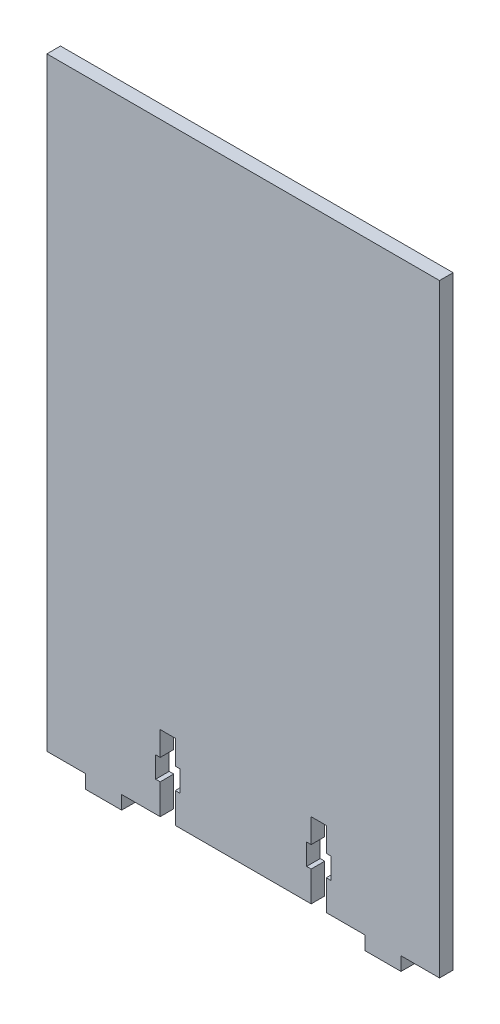
ISO-10303-21;
HEADER;
FILE_DESCRIPTION(('STEP AP214'),'2;1');
FILE_NAME('part.step','',(''),(''),'','','');
FILE_SCHEMA(('AUTOMOTIVE_DESIGN { 1 0 10303 214 1 1 1 1 }'));
ENDSEC;
DATA;
#1=APPLICATION_CONTEXT('core data for automotive mechanical design processes');
#2=APPLICATION_PROTOCOL_DEFINITION('international standard','automotive_design',2000,#1);
#3=PRODUCT_CONTEXT('',#1,'mechanical');
#4=PRODUCT('Part','Part','',(#3));
#5=PRODUCT_RELATED_PRODUCT_CATEGORY('part','',(#4));
#6=PRODUCT_DEFINITION_FORMATION('','',#4);
#7=PRODUCT_DEFINITION_CONTEXT('part definition',#1,'design');
#8=PRODUCT_DEFINITION('design','',#6,#7);
#9=PRODUCT_DEFINITION_SHAPE('','',#8);
#10=(LENGTH_UNIT() NAMED_UNIT(*) SI_UNIT(.MILLI.,.METRE.));
#11=(NAMED_UNIT(*) PLANE_ANGLE_UNIT() SI_UNIT($,.RADIAN.));
#12=(NAMED_UNIT(*) SI_UNIT($,.STERADIAN.) SOLID_ANGLE_UNIT());
#13=UNCERTAINTY_MEASURE_WITH_UNIT(LENGTH_MEASURE(1.E-05),#10,'distance_accuracy_value','');
#14=(GEOMETRIC_REPRESENTATION_CONTEXT(3) GLOBAL_UNCERTAINTY_ASSIGNED_CONTEXT((#13)) GLOBAL_UNIT_ASSIGNED_CONTEXT((#10,
#11,#12)) REPRESENTATION_CONTEXT('',''));
#15=CARTESIAN_POINT('',(0.,0.,0.));
#16=DIRECTION('',(0.,0.,1.));
#17=DIRECTION('',(1.,0.,0.));
#18=AXIS2_PLACEMENT_3D('',#15,#16,#17);
#19=CARTESIAN_POINT('',(-65.,-100.,4.5));
#20=DIRECTION('',(0.,1.,0.));
#21=DIRECTION('',(0.,0.,1.));
#22=AXIS2_PLACEMENT_3D('',#19,#20,#21);
#23=PLANE('',#22);
#24=DIRECTION('',(0.,0.,1.));
#25=VECTOR('',#24,1.);
#26=CARTESIAN_POINT('',(52.25,-100.,-12.8160056179763));
#27=LINE('',#26,#25);
#28=CARTESIAN_POINT('',(52.25,-100.,0.));
#29=VERTEX_POINT('',#28);
#30=CARTESIAN_POINT('',(52.25,-100.,4.5));
#31=VERTEX_POINT('',#30);
#32=EDGE_CURVE('E298',#29,#31,#27,.T.);
#33=ORIENTED_EDGE('',*,*,#32,.F.);
#34=DIRECTION('',(1.,0.,0.));
#35=VECTOR('',#34,1.);
#36=CARTESIAN_POINT('',(-65.,-100.,0.));
#37=LINE('',#36,#35);
#38=CARTESIAN_POINT('',(65.,-100.,0.));
#39=VERTEX_POINT('',#38);
#40=EDGE_CURVE('E621',#29,#39,#37,.T.);
#41=ORIENTED_EDGE('',*,*,#40,.T.);
#42=DIRECTION('',(0.,0.,-1.));
#43=VECTOR('',#42,1.);
#44=CARTESIAN_POINT('',(65.,-100.,4.5));
#45=LINE('',#44,#43);
#46=CARTESIAN_POINT('',(65.,-100.,4.5));
#47=VERTEX_POINT('',#46);
#48=EDGE_CURVE('E609',#47,#39,#45,.T.);
#49=ORIENTED_EDGE('',*,*,#48,.F.);
#50=DIRECTION('',(1.,0.,0.));
#51=VECTOR('',#50,1.);
#52=CARTESIAN_POINT('',(-65.,-100.,4.5));
#53=LINE('',#52,#51);
#54=EDGE_CURVE('E57',#31,#47,#53,.T.);
#55=ORIENTED_EDGE('',*,*,#54,.F.);
#56=EDGE_LOOP('',(#33,#41,#49,#55));
#57=FACE_BOUND('',#56,.T.);
#58=ADVANCED_FACE('F41',(#57),#23,.F.);
#59=DIRECTION('',(0.,0.,1.));
#60=VECTOR('',#59,1.);
#61=CARTESIAN_POINT('',(-40.25,-100.,-12.8160056179763));
#62=LINE('',#61,#60);
#63=CARTESIAN_POINT('',(-40.25,-100.,0.));
#64=VERTEX_POINT('',#63);
#65=CARTESIAN_POINT('',(-40.25,-100.,4.5));
#66=VERTEX_POINT('',#65);
#67=EDGE_CURVE('E343',#64,#66,#62,.T.);
#68=ORIENTED_EDGE('',*,*,#67,.F.);
#69=CARTESIAN_POINT('',(-27.5,-100.,0.));
#70=VERTEX_POINT('',#69);
#71=EDGE_CURVE('E624',#64,#70,#37,.T.);
#72=ORIENTED_EDGE('',*,*,#71,.T.);
#73=DIRECTION('',(0.,0.,1.));
#74=VECTOR('',#73,1.);
#75=CARTESIAN_POINT('',(-27.5,-100.,0.));
#76=LINE('',#75,#74);
#77=CARTESIAN_POINT('',(-27.5,-100.,4.5));
#78=VERTEX_POINT('',#77);
#79=EDGE_CURVE('E561',#70,#78,#76,.T.);
#80=ORIENTED_EDGE('',*,*,#79,.T.);
#81=EDGE_CURVE('E610',#66,#78,#53,.T.);
#82=ORIENTED_EDGE('',*,*,#81,.F.);
#83=EDGE_LOOP('',(#68,#72,#80,#82));
#84=FACE_BOUND('',#83,.T.);
#85=ADVANCED_FACE('F665',(#84),#23,.F.);
#86=CARTESIAN_POINT('',(-22.5,-100.,0.));
#87=VERTEX_POINT('',#86);
#88=CARTESIAN_POINT('',(22.5,-100.,0.));
#89=VERTEX_POINT('',#88);
#90=EDGE_CURVE('E625',#87,#89,#37,.T.);
#91=ORIENTED_EDGE('',*,*,#90,.T.);
#92=DIRECTION('',(0.,0.,1.));
#93=VECTOR('',#92,1.);
#94=CARTESIAN_POINT('',(22.5,-100.,0.));
#95=LINE('',#94,#93);
#96=CARTESIAN_POINT('',(22.5,-100.,4.5));
#97=VERTEX_POINT('',#96);
#98=EDGE_CURVE('E400',#89,#97,#95,.T.);
#99=ORIENTED_EDGE('',*,*,#98,.T.);
#100=CARTESIAN_POINT('',(-22.5,-100.,4.5));
#101=VERTEX_POINT('',#100);
#102=EDGE_CURVE('E611',#101,#97,#53,.T.);
#103=ORIENTED_EDGE('',*,*,#102,.F.);
#104=DIRECTION('',(0.,0.,1.));
#105=VECTOR('',#104,1.);
#106=CARTESIAN_POINT('',(-22.5,-100.,0.));
#107=LINE('',#106,#105);
#108=EDGE_CURVE('E557',#87,#101,#107,.T.);
#109=ORIENTED_EDGE('',*,*,#108,.F.);
#110=EDGE_LOOP('',(#91,#99,#103,#109));
#111=FACE_BOUND('',#110,.T.);
#112=ADVANCED_FACE('F689',(#111),#23,.F.);
#113=CARTESIAN_POINT('',(27.5,-100.,0.));
#114=VERTEX_POINT('',#113);
#115=CARTESIAN_POINT('',(40.25,-100.,0.));
#116=VERTEX_POINT('',#115);
#117=EDGE_CURVE('E699',#114,#116,#37,.T.);
#118=ORIENTED_EDGE('',*,*,#117,.T.);
#119=DIRECTION('',(0.,0.,1.));
#120=VECTOR('',#119,1.);
#121=CARTESIAN_POINT('',(40.25,-100.,-12.8160056179763));
#122=LINE('',#121,#120);
#123=CARTESIAN_POINT('',(40.25,-100.,4.5));
#124=VERTEX_POINT('',#123);
#125=EDGE_CURVE('E65',#116,#124,#122,.T.);
#126=ORIENTED_EDGE('',*,*,#125,.T.);
#127=CARTESIAN_POINT('',(27.5,-100.,4.5));
#128=VERTEX_POINT('',#127);
#129=EDGE_CURVE('E303',#128,#124,#53,.T.);
#130=ORIENTED_EDGE('',*,*,#129,.F.);
#131=DIRECTION('',(0.,0.,1.));
#132=VECTOR('',#131,1.);
#133=CARTESIAN_POINT('',(27.5,-100.,0.));
#134=LINE('',#133,#132);
#135=EDGE_CURVE('E473',#114,#128,#134,.T.);
#136=ORIENTED_EDGE('',*,*,#135,.F.);
#137=EDGE_LOOP('',(#118,#126,#130,#136));
#138=FACE_BOUND('',#137,.T.);
#139=ADVANCED_FACE('F685',(#138),#23,.F.);
#140=CARTESIAN_POINT('',(-65.,-100.,0.));
#141=VERTEX_POINT('',#140);
#142=CARTESIAN_POINT('',(-52.25,-100.,0.));
#143=VERTEX_POINT('',#142);
#144=EDGE_CURVE('E599',#141,#143,#37,.T.);
#145=ORIENTED_EDGE('',*,*,#144,.T.);
#146=DIRECTION('',(0.,0.,1.));
#147=VECTOR('',#146,1.);
#148=CARTESIAN_POINT('',(-52.25,-100.,-12.8160056179763));
#149=LINE('',#148,#147);
#150=CARTESIAN_POINT('',(-52.25,-100.,4.5));
#151=VERTEX_POINT('',#150);
#152=EDGE_CURVE('E349',#143,#151,#149,.T.);
#153=ORIENTED_EDGE('',*,*,#152,.T.);
#154=CARTESIAN_POINT('',(-65.,-100.,4.5));
#155=VERTEX_POINT('',#154);
#156=EDGE_CURVE('E605',#155,#151,#53,.T.);
#157=ORIENTED_EDGE('',*,*,#156,.F.);
#158=DIRECTION('',(0.,0.,-1.));
#159=VECTOR('',#158,1.);
#160=CARTESIAN_POINT('',(-65.,-100.,4.5));
#161=LINE('',#160,#159);
#162=EDGE_CURVE('E629',#155,#141,#161,.T.);
#163=ORIENTED_EDGE('',*,*,#162,.T.);
#164=EDGE_LOOP('',(#145,#153,#157,#163));
#165=FACE_BOUND('',#164,.T.);
#166=ADVANCED_FACE('F648',(#165),#23,.F.);
#167=CARTESIAN_POINT('',(0.,0.,4.5));
#168=DIRECTION('',(0.,0.,1.));
#169=DIRECTION('',(1.,0.,0.));
#170=AXIS2_PLACEMENT_3D('',#167,#168,#169);
#171=PLANE('',#170);
#172=DIRECTION('',(0.,-1.,0.));
#173=VECTOR('',#172,1.);
#174=CARTESIAN_POINT('',(22.5000000000001,0.,4.5));
#175=LINE('',#174,#173);
#176=CARTESIAN_POINT('',(22.5,-90.,4.5));
#177=VERTEX_POINT('',#176);
#178=EDGE_CURVE('E329',#177,#97,#175,.T.);
#179=ORIENTED_EDGE('',*,*,#178,.F.);
#180=DIRECTION('',(1.,0.,0.));
#181=VECTOR('',#180,1.);
#182=CARTESIAN_POINT('',(0.,-90.,4.5));
#183=LINE('',#182,#181);
#184=CARTESIAN_POINT('',(21.,-90.,4.5));
#185=VERTEX_POINT('',#184);
#186=EDGE_CURVE('E360',#185,#177,#183,.T.);
#187=ORIENTED_EDGE('',*,*,#186,.F.);
#188=DIRECTION('',(0.,-1.,0.));
#189=VECTOR('',#188,1.);
#190=CARTESIAN_POINT('',(21.0000000000001,0.,4.5));
#191=LINE('',#190,#189);
#192=CARTESIAN_POINT('',(21.,-83.,4.5));
#193=VERTEX_POINT('',#192);
#194=EDGE_CURVE('E435',#193,#185,#191,.T.);
#195=ORIENTED_EDGE('',*,*,#194,.F.);
#196=DIRECTION('',(-1.,0.,0.));
#197=VECTOR('',#196,1.);
#198=CARTESIAN_POINT('',(0.,-83.,4.5));
#199=LINE('',#198,#197);
#200=CARTESIAN_POINT('',(22.5,-83.,4.5));
#201=VERTEX_POINT('',#200);
#202=EDGE_CURVE('E431',#201,#193,#199,.T.);
#203=ORIENTED_EDGE('',*,*,#202,.F.);
#204=DIRECTION('',(0.,-1.,0.));
#205=VECTOR('',#204,1.);
#206=CARTESIAN_POINT('',(22.5,0.,4.5));
#207=LINE('',#206,#205);
#208=CARTESIAN_POINT('',(22.5,-75.,4.5));
#209=VERTEX_POINT('',#208);
#210=EDGE_CURVE('E427',#209,#201,#207,.T.);
#211=ORIENTED_EDGE('',*,*,#210,.F.);
#212=DIRECTION('',(-1.,0.,0.));
#213=VECTOR('',#212,1.);
#214=CARTESIAN_POINT('',(0.,-75.,4.5));
#215=LINE('',#214,#213);
#216=CARTESIAN_POINT('',(27.5,-75.,4.5));
#217=VERTEX_POINT('',#216);
#218=EDGE_CURVE('E423',#217,#209,#215,.T.);
#219=ORIENTED_EDGE('',*,*,#218,.F.);
#220=DIRECTION('',(0.,1.,0.));
#221=VECTOR('',#220,1.);
#222=CARTESIAN_POINT('',(27.5,0.,4.5));
#223=LINE('',#222,#221);
#224=CARTESIAN_POINT('',(27.5,-83.,4.5));
#225=VERTEX_POINT('',#224);
#226=EDGE_CURVE('E419',#225,#217,#223,.T.);
#227=ORIENTED_EDGE('',*,*,#226,.F.);
#228=DIRECTION('',(-1.,0.,0.));
#229=VECTOR('',#228,1.);
#230=CARTESIAN_POINT('',(0.,-83.,4.5));
#231=LINE('',#230,#229);
#232=CARTESIAN_POINT('',(29.,-83.,4.5));
#233=VERTEX_POINT('',#232);
#234=EDGE_CURVE('E415',#233,#225,#231,.T.);
#235=ORIENTED_EDGE('',*,*,#234,.F.);
#236=DIRECTION('',(0.,1.,0.));
#237=VECTOR('',#236,1.);
#238=CARTESIAN_POINT('',(28.9999999999999,0.,4.5));
#239=LINE('',#238,#237);
#240=CARTESIAN_POINT('',(29.,-90.,4.5));
#241=VERTEX_POINT('',#240);
#242=EDGE_CURVE('E411',#241,#233,#239,.T.);
#243=ORIENTED_EDGE('',*,*,#242,.F.);
#244=DIRECTION('',(1.,0.,0.));
#245=VECTOR('',#244,1.);
#246=CARTESIAN_POINT('',(0.,-90.,4.5));
#247=LINE('',#246,#245);
#248=CARTESIAN_POINT('',(27.5,-90.,4.5));
#249=VERTEX_POINT('',#248);
#250=EDGE_CURVE('E407',#249,#241,#247,.T.);
#251=ORIENTED_EDGE('',*,*,#250,.F.);
#252=DIRECTION('',(0.,1.,0.));
#253=VECTOR('',#252,1.);
#254=CARTESIAN_POINT('',(27.5,0.,4.5));
#255=LINE('',#254,#253);
#256=EDGE_CURVE('E403',#128,#249,#255,.T.);
#257=ORIENTED_EDGE('',*,*,#256,.F.);
#258=ORIENTED_EDGE('',*,*,#129,.T.);
#259=DIRECTION('',(0.,-1.,0.));
#260=VECTOR('',#259,1.);
#261=CARTESIAN_POINT('',(40.2500000000001,0.,4.5));
#262=LINE('',#261,#260);
#263=CARTESIAN_POINT('',(40.25,-104.5,4.5));
#264=VERTEX_POINT('',#263);
#265=EDGE_CURVE('E282',#124,#264,#262,.T.);
#266=ORIENTED_EDGE('',*,*,#265,.T.);
#267=DIRECTION('',(-1.,0.,0.));
#268=VECTOR('',#267,1.);
#269=CARTESIAN_POINT('',(0.,-104.5,4.5));
#270=LINE('',#269,#268);
#271=CARTESIAN_POINT('',(52.25,-104.5,4.5));
#272=VERTEX_POINT('',#271);
#273=EDGE_CURVE('E291',#272,#264,#270,.T.);
#274=ORIENTED_EDGE('',*,*,#273,.F.);
#275=DIRECTION('',(0.,-1.,0.));
#276=VECTOR('',#275,1.);
#277=CARTESIAN_POINT('',(52.25,0.,4.5));
#278=LINE('',#277,#276);
#279=EDGE_CURVE('E305',#31,#272,#278,.T.);
#280=ORIENTED_EDGE('',*,*,#279,.F.);
#281=ORIENTED_EDGE('',*,*,#54,.T.);
#282=DIRECTION('',(0.,1.,0.));
#283=VECTOR('',#282,1.);
#284=CARTESIAN_POINT('',(65.,100.,4.5));
#285=LINE('',#284,#283);
#286=CARTESIAN_POINT('',(65.,100.,4.5));
#287=VERTEX_POINT('',#286);
#288=EDGE_CURVE('E594',#47,#287,#285,.T.);
#289=ORIENTED_EDGE('',*,*,#288,.T.);
#290=DIRECTION('',(-1.,0.,0.));
#291=VECTOR('',#290,1.);
#292=CARTESIAN_POINT('',(-65.,100.,4.5));
#293=LINE('',#292,#291);
#294=CARTESIAN_POINT('',(-65.,100.,4.5));
#295=VERTEX_POINT('',#294);
#296=EDGE_CURVE('E598',#287,#295,#293,.T.);
#297=ORIENTED_EDGE('',*,*,#296,.T.);
#298=DIRECTION('',(0.,-1.,0.));
#299=VECTOR('',#298,1.);
#300=CARTESIAN_POINT('',(-65.,100.,4.5));
#301=LINE('',#300,#299);
#302=EDGE_CURVE('E602',#295,#155,#301,.T.);
#303=ORIENTED_EDGE('',*,*,#302,.T.);
#304=ORIENTED_EDGE('',*,*,#156,.T.);
#305=DIRECTION('',(0.,-1.,0.));
#306=VECTOR('',#305,1.);
#307=CARTESIAN_POINT('',(-52.25,0.,4.5));
#308=LINE('',#307,#306);
#309=CARTESIAN_POINT('',(-52.25,-104.5,4.5));
#310=VERTEX_POINT('',#309);
#311=EDGE_CURVE('E334',#151,#310,#308,.T.);
#312=ORIENTED_EDGE('',*,*,#311,.T.);
#313=DIRECTION('',(1.,0.,0.));
#314=VECTOR('',#313,1.);
#315=CARTESIAN_POINT('',(0.,-104.5,4.5));
#316=LINE('',#315,#314);
#317=CARTESIAN_POINT('',(-40.25,-104.5,4.5));
#318=VERTEX_POINT('',#317);
#319=EDGE_CURVE('E339',#310,#318,#316,.T.);
#320=ORIENTED_EDGE('',*,*,#319,.T.);
#321=DIRECTION('',(0.,-1.,0.));
#322=VECTOR('',#321,1.);
#323=CARTESIAN_POINT('',(-40.2500000000001,0.,4.5));
#324=LINE('',#323,#322);
#325=EDGE_CURVE('E330',#66,#318,#324,.T.);
#326=ORIENTED_EDGE('',*,*,#325,.F.);
#327=ORIENTED_EDGE('',*,*,#81,.T.);
#328=DIRECTION('',(0.,1.,0.));
#329=VECTOR('',#328,1.);
#330=CARTESIAN_POINT('',(-27.5,0.,4.5));
#331=LINE('',#330,#329);
#332=CARTESIAN_POINT('',(-27.5,-90.,4.5));
#333=VERTEX_POINT('',#332);
#334=EDGE_CURVE('E483',#78,#333,#331,.T.);
#335=ORIENTED_EDGE('',*,*,#334,.T.);
#336=DIRECTION('',(-1.,0.,0.));
#337=VECTOR('',#336,1.);
#338=CARTESIAN_POINT('',(0.,-90.,4.5));
#339=LINE('',#338,#337);
#340=CARTESIAN_POINT('',(-29.,-90.,4.5));
#341=VERTEX_POINT('',#340);
#342=EDGE_CURVE('E550',#333,#341,#339,.T.);
#343=ORIENTED_EDGE('',*,*,#342,.T.);
#344=DIRECTION('',(0.,1.,0.));
#345=VECTOR('',#344,1.);
#346=CARTESIAN_POINT('',(-28.9999999999999,0.,4.5));
#347=LINE('',#346,#345);
#348=CARTESIAN_POINT('',(-29.,-83.,4.5));
#349=VERTEX_POINT('',#348);
#350=EDGE_CURVE('E546',#341,#349,#347,.T.);
#351=ORIENTED_EDGE('',*,*,#350,.T.);
#352=DIRECTION('',(1.,0.,0.));
#353=VECTOR('',#352,1.);
#354=CARTESIAN_POINT('',(0.,-83.,4.5));
#355=LINE('',#354,#353);
#356=CARTESIAN_POINT('',(-27.5,-83.,4.5));
#357=VERTEX_POINT('',#356);
#358=EDGE_CURVE('E542',#349,#357,#355,.T.);
#359=ORIENTED_EDGE('',*,*,#358,.T.);
#360=DIRECTION('',(0.,1.,0.));
#361=VECTOR('',#360,1.);
#362=CARTESIAN_POINT('',(-27.5,0.,4.5));
#363=LINE('',#362,#361);
#364=CARTESIAN_POINT('',(-27.5,-75.,4.5));
#365=VERTEX_POINT('',#364);
#366=EDGE_CURVE('E538',#357,#365,#363,.T.);
#367=ORIENTED_EDGE('',*,*,#366,.T.);
#368=DIRECTION('',(1.,0.,0.));
#369=VECTOR('',#368,1.);
#370=CARTESIAN_POINT('',(0.,-75.,4.5));
#371=LINE('',#370,#369);
#372=CARTESIAN_POINT('',(-22.5,-75.,4.5));
#373=VERTEX_POINT('',#372);
#374=EDGE_CURVE('E534',#365,#373,#371,.T.);
#375=ORIENTED_EDGE('',*,*,#374,.T.);
#376=DIRECTION('',(0.,-1.,0.));
#377=VECTOR('',#376,1.);
#378=CARTESIAN_POINT('',(-22.5,0.,4.5));
#379=LINE('',#378,#377);
#380=CARTESIAN_POINT('',(-22.5,-83.,4.5));
#381=VERTEX_POINT('',#380);
#382=EDGE_CURVE('E530',#373,#381,#379,.T.);
#383=ORIENTED_EDGE('',*,*,#382,.T.);
#384=DIRECTION('',(1.,0.,0.));
#385=VECTOR('',#384,1.);
#386=CARTESIAN_POINT('',(0.,-83.,4.5));
#387=LINE('',#386,#385);
#388=CARTESIAN_POINT('',(-21.,-83.,4.5));
#389=VERTEX_POINT('',#388);
#390=EDGE_CURVE('E526',#381,#389,#387,.T.);
#391=ORIENTED_EDGE('',*,*,#390,.T.);
#392=DIRECTION('',(0.,-1.,0.));
#393=VECTOR('',#392,1.);
#394=CARTESIAN_POINT('',(-21.0000000000001,0.,4.5));
#395=LINE('',#394,#393);
#396=CARTESIAN_POINT('',(-21.,-90.,4.5));
#397=VERTEX_POINT('',#396);
#398=EDGE_CURVE('E522',#389,#397,#395,.T.);
#399=ORIENTED_EDGE('',*,*,#398,.T.);
#400=DIRECTION('',(-1.,0.,0.));
#401=VECTOR('',#400,1.);
#402=CARTESIAN_POINT('',(0.,-90.,4.5));
#403=LINE('',#402,#401);
#404=CARTESIAN_POINT('',(-22.5,-90.,4.5));
#405=VERTEX_POINT('',#404);
#406=EDGE_CURVE('E518',#397,#405,#403,.T.);
#407=ORIENTED_EDGE('',*,*,#406,.T.);
#408=DIRECTION('',(0.,-1.,0.));
#409=VECTOR('',#408,1.);
#410=CARTESIAN_POINT('',(-22.5000000000001,0.,4.5));
#411=LINE('',#410,#409);
#412=EDGE_CURVE('E445',#405,#101,#411,.T.);
#413=ORIENTED_EDGE('',*,*,#412,.T.);
#414=ORIENTED_EDGE('',*,*,#102,.T.);
#415=EDGE_LOOP('',(#179,#187,#195,#203,#211,#219,#227,#235,#243,#251,#257,#258,#266,#274,#280,
#281,#289,#297,#303,#304,#312,#320,#326,#327,#335,#343,#351,#359,#367,#375,#383,#391,#399,#407,
#413,#414));
#416=FACE_BOUND('',#415,.T.);
#417=ADVANCED_FACE('F301',(#416),#171,.T.);
#418=CARTESIAN_POINT('',(0.,0.,0.));
#419=DIRECTION('',(0.,0.,1.));
#420=DIRECTION('',(1.,0.,0.));
#421=AXIS2_PLACEMENT_3D('',#418,#419,#420);
#422=PLANE('',#421);
#423=DIRECTION('',(1.,0.,0.));
#424=VECTOR('',#423,1.);
#425=CARTESIAN_POINT('',(0.,-90.,0.));
#426=LINE('',#425,#424);
#427=CARTESIAN_POINT('',(21.,-90.,0.));
#428=VERTEX_POINT('',#427);
#429=CARTESIAN_POINT('',(22.5,-90.,0.));
#430=VERTEX_POINT('',#429);
#431=EDGE_CURVE('E396',#428,#430,#426,.T.);
#432=ORIENTED_EDGE('',*,*,#431,.T.);
#433=DIRECTION('',(0.,-1.,0.));
#434=VECTOR('',#433,1.);
#435=CARTESIAN_POINT('',(22.5000000000001,0.,0.));
#436=LINE('',#435,#434);
#437=EDGE_CURVE('E355',#430,#89,#436,.T.);
#438=ORIENTED_EDGE('',*,*,#437,.T.);
#439=ORIENTED_EDGE('',*,*,#90,.F.);
#440=DIRECTION('',(0.,-1.,0.));
#441=VECTOR('',#440,1.);
#442=CARTESIAN_POINT('',(-22.5000000000001,0.,0.));
#443=LINE('',#442,#441);
#444=CARTESIAN_POINT('',(-22.5,-90.,0.));
#445=VERTEX_POINT('',#444);
#446=EDGE_CURVE('E479',#445,#87,#443,.T.);
#447=ORIENTED_EDGE('',*,*,#446,.F.);
#448=DIRECTION('',(-1.,0.,0.));
#449=VECTOR('',#448,1.);
#450=CARTESIAN_POINT('',(0.,-90.,0.));
#451=LINE('',#450,#449);
#452=CARTESIAN_POINT('',(-21.,-90.,0.));
#453=VERTEX_POINT('',#452);
#454=EDGE_CURVE('E482',#453,#445,#451,.T.);
#455=ORIENTED_EDGE('',*,*,#454,.F.);
#456=DIRECTION('',(0.,-1.,0.));
#457=VECTOR('',#456,1.);
#458=CARTESIAN_POINT('',(-21.0000000000001,0.,0.));
#459=LINE('',#458,#457);
#460=CARTESIAN_POINT('',(-21.,-83.,0.));
#461=VERTEX_POINT('',#460);
#462=EDGE_CURVE('E486',#461,#453,#459,.T.);
#463=ORIENTED_EDGE('',*,*,#462,.F.);
#464=DIRECTION('',(1.,0.,0.));
#465=VECTOR('',#464,1.);
#466=CARTESIAN_POINT('',(0.,-83.,0.));
#467=LINE('',#466,#465);
#468=CARTESIAN_POINT('',(-22.5,-83.,0.));
#469=VERTEX_POINT('',#468);
#470=EDGE_CURVE('E490',#469,#461,#467,.T.);
#471=ORIENTED_EDGE('',*,*,#470,.F.);
#472=DIRECTION('',(0.,-1.,0.));
#473=VECTOR('',#472,1.);
#474=CARTESIAN_POINT('',(-22.5,0.,0.));
#475=LINE('',#474,#473);
#476=CARTESIAN_POINT('',(-22.5,-75.,0.));
#477=VERTEX_POINT('',#476);
#478=EDGE_CURVE('E493',#477,#469,#475,.T.);
#479=ORIENTED_EDGE('',*,*,#478,.F.);
#480=DIRECTION('',(1.,0.,0.));
#481=VECTOR('',#480,1.);
#482=CARTESIAN_POINT('',(0.,-75.,0.));
#483=LINE('',#482,#481);
#484=CARTESIAN_POINT('',(-27.5,-75.,0.));
#485=VERTEX_POINT('',#484);
#486=EDGE_CURVE('E496',#485,#477,#483,.T.);
#487=ORIENTED_EDGE('',*,*,#486,.F.);
#488=DIRECTION('',(0.,1.,0.));
#489=VECTOR('',#488,1.);
#490=CARTESIAN_POINT('',(-27.5,0.,0.));
#491=LINE('',#490,#489);
#492=CARTESIAN_POINT('',(-27.5,-83.,0.));
#493=VERTEX_POINT('',#492);
#494=EDGE_CURVE('E499',#493,#485,#491,.T.);
#495=ORIENTED_EDGE('',*,*,#494,.F.);
#496=DIRECTION('',(1.,0.,0.));
#497=VECTOR('',#496,1.);
#498=CARTESIAN_POINT('',(0.,-83.,0.));
#499=LINE('',#498,#497);
#500=CARTESIAN_POINT('',(-29.,-83.,0.));
#501=VERTEX_POINT('',#500);
#502=EDGE_CURVE('E502',#501,#493,#499,.T.);
#503=ORIENTED_EDGE('',*,*,#502,.F.);
#504=DIRECTION('',(0.,1.,0.));
#505=VECTOR('',#504,1.);
#506=CARTESIAN_POINT('',(-28.9999999999999,0.,0.));
#507=LINE('',#506,#505);
#508=CARTESIAN_POINT('',(-29.,-90.,0.));
#509=VERTEX_POINT('',#508);
#510=EDGE_CURVE('E505',#509,#501,#507,.T.);
#511=ORIENTED_EDGE('',*,*,#510,.F.);
#512=DIRECTION('',(-1.,0.,0.));
#513=VECTOR('',#512,1.);
#514=CARTESIAN_POINT('',(0.,-90.,0.));
#515=LINE('',#514,#513);
#516=CARTESIAN_POINT('',(-27.5,-90.,0.));
#517=VERTEX_POINT('',#516);
#518=EDGE_CURVE('E508',#517,#509,#515,.T.);
#519=ORIENTED_EDGE('',*,*,#518,.F.);
#520=DIRECTION('',(0.,1.,0.));
#521=VECTOR('',#520,1.);
#522=CARTESIAN_POINT('',(-27.5,0.,0.));
#523=LINE('',#522,#521);
#524=EDGE_CURVE('E511',#70,#517,#523,.T.);
#525=ORIENTED_EDGE('',*,*,#524,.F.);
#526=ORIENTED_EDGE('',*,*,#71,.F.);
#527=DIRECTION('',(0.,1.,0.));
#528=VECTOR('',#527,1.);
#529=CARTESIAN_POINT('',(-40.2500000000001,0.,0.));
#530=LINE('',#529,#528);
#531=CARTESIAN_POINT('',(-40.25,-104.5,0.));
#532=VERTEX_POINT('',#531);
#533=EDGE_CURVE('E325',#532,#64,#530,.T.);
#534=ORIENTED_EDGE('',*,*,#533,.F.);
#535=DIRECTION('',(-1.,0.,0.));
#536=VECTOR('',#535,1.);
#537=CARTESIAN_POINT('',(0.,-104.5,0.));
#538=LINE('',#537,#536);
#539=CARTESIAN_POINT('',(-52.25,-104.5,0.));
#540=VERTEX_POINT('',#539);
#541=EDGE_CURVE('E321',#532,#540,#538,.T.);
#542=ORIENTED_EDGE('',*,*,#541,.T.);
#543=DIRECTION('',(0.,1.,0.));
#544=VECTOR('',#543,1.);
#545=CARTESIAN_POINT('',(-52.25,0.,0.));
#546=LINE('',#545,#544);
#547=EDGE_CURVE('E317',#540,#143,#546,.T.);
#548=ORIENTED_EDGE('',*,*,#547,.T.);
#549=ORIENTED_EDGE('',*,*,#144,.F.);
#550=DIRECTION('',(0.,-1.,0.));
#551=VECTOR('',#550,1.);
#552=CARTESIAN_POINT('',(-65.,100.,0.));
#553=LINE('',#552,#551);
#554=CARTESIAN_POINT('',(-65.,100.,0.));
#555=VERTEX_POINT('',#554);
#556=EDGE_CURVE('E618',#555,#141,#553,.T.);
#557=ORIENTED_EDGE('',*,*,#556,.F.);
#558=DIRECTION('',(-1.,0.,0.));
#559=VECTOR('',#558,1.);
#560=CARTESIAN_POINT('',(-65.,100.,0.));
#561=LINE('',#560,#559);
#562=CARTESIAN_POINT('',(65.,100.,0.));
#563=VERTEX_POINT('',#562);
#564=EDGE_CURVE('E615',#563,#555,#561,.T.);
#565=ORIENTED_EDGE('',*,*,#564,.F.);
#566=DIRECTION('',(0.,1.,0.));
#567=VECTOR('',#566,1.);
#568=CARTESIAN_POINT('',(65.,100.,0.));
#569=LINE('',#568,#567);
#570=EDGE_CURVE('E560',#39,#563,#569,.T.);
#571=ORIENTED_EDGE('',*,*,#570,.F.);
#572=ORIENTED_EDGE('',*,*,#40,.F.);
#573=DIRECTION('',(0.,1.,0.));
#574=VECTOR('',#573,1.);
#575=CARTESIAN_POINT('',(52.25,0.,0.));
#576=LINE('',#575,#574);
#577=CARTESIAN_POINT('',(52.25,-104.5,0.));
#578=VERTEX_POINT('',#577);
#579=EDGE_CURVE('E335',#578,#29,#576,.T.);
#580=ORIENTED_EDGE('',*,*,#579,.F.);
#581=DIRECTION('',(1.,0.,0.));
#582=VECTOR('',#581,1.);
#583=CARTESIAN_POINT('',(0.,-104.5,0.));
#584=LINE('',#583,#582);
#585=CARTESIAN_POINT('',(40.25,-104.5,0.));
#586=VERTEX_POINT('',#585);
#587=EDGE_CURVE('E701',#586,#578,#584,.T.);
#588=ORIENTED_EDGE('',*,*,#587,.F.);
#589=DIRECTION('',(0.,1.,0.));
#590=VECTOR('',#589,1.);
#591=CARTESIAN_POINT('',(40.2500000000001,0.,0.));
#592=LINE('',#591,#590);
#593=EDGE_CURVE('E284',#586,#116,#592,.T.);
#594=ORIENTED_EDGE('',*,*,#593,.T.);
#595=ORIENTED_EDGE('',*,*,#117,.F.);
#596=DIRECTION('',(0.,1.,0.));
#597=VECTOR('',#596,1.);
#598=CARTESIAN_POINT('',(27.5,0.,0.));
#599=LINE('',#598,#597);
#600=CARTESIAN_POINT('',(27.5,-90.,0.));
#601=VERTEX_POINT('',#600);
#602=EDGE_CURVE('E359',#114,#601,#599,.T.);
#603=ORIENTED_EDGE('',*,*,#602,.T.);
#604=DIRECTION('',(1.,0.,0.));
#605=VECTOR('',#604,1.);
#606=CARTESIAN_POINT('',(0.,-90.,0.));
#607=LINE('',#606,#605);
#608=CARTESIAN_POINT('',(29.,-90.,0.));
#609=VERTEX_POINT('',#608);
#610=EDGE_CURVE('E364',#601,#609,#607,.T.);
#611=ORIENTED_EDGE('',*,*,#610,.T.);
#612=DIRECTION('',(0.,1.,0.));
#613=VECTOR('',#612,1.);
#614=CARTESIAN_POINT('',(28.9999999999999,0.,0.));
#615=LINE('',#614,#613);
#616=CARTESIAN_POINT('',(29.,-83.,0.));
#617=VERTEX_POINT('',#616);
#618=EDGE_CURVE('E368',#609,#617,#615,.T.);
#619=ORIENTED_EDGE('',*,*,#618,.T.);
#620=DIRECTION('',(-1.,0.,0.));
#621=VECTOR('',#620,1.);
#622=CARTESIAN_POINT('',(0.,-83.,0.));
#623=LINE('',#622,#621);
#624=CARTESIAN_POINT('',(27.5,-83.,0.));
#625=VERTEX_POINT('',#624);
#626=EDGE_CURVE('E372',#617,#625,#623,.T.);
#627=ORIENTED_EDGE('',*,*,#626,.T.);
#628=DIRECTION('',(0.,1.,0.));
#629=VECTOR('',#628,1.);
#630=CARTESIAN_POINT('',(27.5,0.,0.));
#631=LINE('',#630,#629);
#632=CARTESIAN_POINT('',(27.5,-75.,0.));
#633=VERTEX_POINT('',#632);
#634=EDGE_CURVE('E376',#625,#633,#631,.T.);
#635=ORIENTED_EDGE('',*,*,#634,.T.);
#636=DIRECTION('',(-1.,0.,0.));
#637=VECTOR('',#636,1.);
#638=CARTESIAN_POINT('',(0.,-75.,0.));
#639=LINE('',#638,#637);
#640=CARTESIAN_POINT('',(22.5,-75.,0.));
#641=VERTEX_POINT('',#640);
#642=EDGE_CURVE('E380',#633,#641,#639,.T.);
#643=ORIENTED_EDGE('',*,*,#642,.T.);
#644=DIRECTION('',(0.,-1.,0.));
#645=VECTOR('',#644,1.);
#646=CARTESIAN_POINT('',(22.5,0.,0.));
#647=LINE('',#646,#645);
#648=CARTESIAN_POINT('',(22.5,-83.,0.));
#649=VERTEX_POINT('',#648);
#650=EDGE_CURVE('E384',#641,#649,#647,.T.);
#651=ORIENTED_EDGE('',*,*,#650,.T.);
#652=DIRECTION('',(-1.,0.,0.));
#653=VECTOR('',#652,1.);
#654=CARTESIAN_POINT('',(0.,-83.,0.));
#655=LINE('',#654,#653);
#656=CARTESIAN_POINT('',(21.,-83.,0.));
#657=VERTEX_POINT('',#656);
#658=EDGE_CURVE('E388',#649,#657,#655,.T.);
#659=ORIENTED_EDGE('',*,*,#658,.T.);
#660=DIRECTION('',(0.,-1.,0.));
#661=VECTOR('',#660,1.);
#662=CARTESIAN_POINT('',(21.0000000000001,0.,0.));
#663=LINE('',#662,#661);
#664=EDGE_CURVE('E392',#657,#428,#663,.T.);
#665=ORIENTED_EDGE('',*,*,#664,.T.);
#666=EDGE_LOOP('',(#432,#438,#439,#447,#455,#463,#471,#479,#487,#495,#503,#511,#519,#525,#526,
#534,#542,#548,#549,#557,#565,#571,#572,#580,#588,#594,#595,#603,#611,#619,#627,#635,#643,#651,
#659,#665));
#667=FACE_BOUND('',#666,.T.);
#668=ADVANCED_FACE('F643',(#667),#422,.F.);
#669=CARTESIAN_POINT('',(65.,100.,4.5));
#670=DIRECTION('',(-1.,0.,0.));
#671=DIRECTION('',(0.,-1.,0.));
#672=AXIS2_PLACEMENT_3D('',#669,#670,#671);
#673=PLANE('',#672);
#674=ORIENTED_EDGE('',*,*,#570,.T.);
#675=DIRECTION('',(0.,0.,-1.));
#676=VECTOR('',#675,1.);
#677=CARTESIAN_POINT('',(65.,100.,4.5));
#678=LINE('',#677,#676);
#679=EDGE_CURVE('E11',#287,#563,#678,.T.);
#680=ORIENTED_EDGE('',*,*,#679,.F.);
#681=ORIENTED_EDGE('',*,*,#288,.F.);
#682=ORIENTED_EDGE('',*,*,#48,.T.);
#683=EDGE_LOOP('',(#674,#680,#681,#682));
#684=FACE_BOUND('',#683,.T.);
#685=ADVANCED_FACE('F43',(#684),#673,.F.);
#686=CARTESIAN_POINT('',(-65.,100.,4.5));
#687=DIRECTION('',(0.,-1.,0.));
#688=DIRECTION('',(0.,0.,-1.));
#689=AXIS2_PLACEMENT_3D('',#686,#687,#688);
#690=PLANE('',#689);
#691=ORIENTED_EDGE('',*,*,#564,.T.);
#692=DIRECTION('',(0.,0.,-1.));
#693=VECTOR('',#692,1.);
#694=CARTESIAN_POINT('',(-65.,100.,4.5));
#695=LINE('',#694,#693);
#696=EDGE_CURVE('E50',#295,#555,#695,.T.);
#697=ORIENTED_EDGE('',*,*,#696,.F.);
#698=ORIENTED_EDGE('',*,*,#296,.F.);
#699=ORIENTED_EDGE('',*,*,#679,.T.);
#700=EDGE_LOOP('',(#691,#697,#698,#699));
#701=FACE_BOUND('',#700,.T.);
#702=ADVANCED_FACE('F675',(#701),#690,.F.);
#703=CARTESIAN_POINT('',(-65.,100.,4.5));
#704=DIRECTION('',(1.,0.,0.));
#705=DIRECTION('',(0.,1.,0.));
#706=AXIS2_PLACEMENT_3D('',#703,#704,#705);
#707=PLANE('',#706);
#708=ORIENTED_EDGE('',*,*,#556,.T.);
#709=ORIENTED_EDGE('',*,*,#162,.F.);
#710=ORIENTED_EDGE('',*,*,#302,.F.);
#711=ORIENTED_EDGE('',*,*,#696,.T.);
#712=EDGE_LOOP('',(#708,#709,#710,#711));
#713=FACE_BOUND('',#712,.T.);
#714=ADVANCED_FACE('F638',(#713),#707,.F.);
#715=CARTESIAN_POINT('',(-22.5000000000001,0.,0.));
#716=DIRECTION('',(-1.,0.,0.));
#717=DIRECTION('',(0.,-1.,0.));
#718=AXIS2_PLACEMENT_3D('',#715,#716,#717);
#719=PLANE('',#718);
#720=ORIENTED_EDGE('',*,*,#412,.F.);
#721=DIRECTION('',(0.,0.,1.));
#722=VECTOR('',#721,1.);
#723=CARTESIAN_POINT('',(-22.5,-90.,0.));
#724=LINE('',#723,#722);
#725=EDGE_CURVE('E514',#445,#405,#724,.T.);
#726=ORIENTED_EDGE('',*,*,#725,.F.);
#727=ORIENTED_EDGE('',*,*,#446,.T.);
#728=ORIENTED_EDGE('',*,*,#108,.T.);
#729=EDGE_LOOP('',(#720,#726,#727,#728));
#730=FACE_BOUND('',#729,.T.);
#731=ADVANCED_FACE('F681',(#730),#719,.T.);
#732=CARTESIAN_POINT('',(-27.5,0.,0.));
#733=DIRECTION('',(1.,0.,0.));
#734=DIRECTION('',(0.,1.,0.));
#735=AXIS2_PLACEMENT_3D('',#732,#733,#734);
#736=PLANE('',#735);
#737=ORIENTED_EDGE('',*,*,#334,.F.);
#738=ORIENTED_EDGE('',*,*,#79,.F.);
#739=ORIENTED_EDGE('',*,*,#524,.T.);
#740=DIRECTION('',(0.,0.,1.));
#741=VECTOR('',#740,1.);
#742=CARTESIAN_POINT('',(-27.5,-90.,0.));
#743=LINE('',#742,#741);
#744=EDGE_CURVE('E565',#517,#333,#743,.T.);
#745=ORIENTED_EDGE('',*,*,#744,.T.);
#746=EDGE_LOOP('',(#737,#738,#739,#745));
#747=FACE_BOUND('',#746,.T.);
#748=ADVANCED_FACE('F773',(#747),#736,.T.);
#749=CARTESIAN_POINT('',(0.,-90.,0.));
#750=DIRECTION('',(0.,1.,0.));
#751=DIRECTION('',(0.,0.,1.));
#752=AXIS2_PLACEMENT_3D('',#749,#750,#751);
#753=PLANE('',#752);
#754=ORIENTED_EDGE('',*,*,#342,.F.);
#755=ORIENTED_EDGE('',*,*,#744,.F.);
#756=ORIENTED_EDGE('',*,*,#518,.T.);
#757=DIRECTION('',(0.,0.,1.));
#758=VECTOR('',#757,1.);
#759=CARTESIAN_POINT('',(-29.,-90.,0.));
#760=LINE('',#759,#758);
#761=EDGE_CURVE('E568',#509,#341,#760,.T.);
#762=ORIENTED_EDGE('',*,*,#761,.T.);
#763=EDGE_LOOP('',(#754,#755,#756,#762));
#764=FACE_BOUND('',#763,.T.);
#765=ADVANCED_FACE('F770',(#764),#753,.T.);
#766=CARTESIAN_POINT('',(-28.9999999999999,0.,0.));
#767=DIRECTION('',(1.,0.,0.));
#768=DIRECTION('',(0.,1.,0.));
#769=AXIS2_PLACEMENT_3D('',#766,#767,#768);
#770=PLANE('',#769);
#771=ORIENTED_EDGE('',*,*,#350,.F.);
#772=ORIENTED_EDGE('',*,*,#761,.F.);
#773=ORIENTED_EDGE('',*,*,#510,.T.);
#774=DIRECTION('',(0.,0.,1.));
#775=VECTOR('',#774,1.);
#776=CARTESIAN_POINT('',(-29.,-83.,0.));
#777=LINE('',#776,#775);
#778=EDGE_CURVE('E571',#501,#349,#777,.T.);
#779=ORIENTED_EDGE('',*,*,#778,.T.);
#780=EDGE_LOOP('',(#771,#772,#773,#779));
#781=FACE_BOUND('',#780,.T.);
#782=ADVANCED_FACE('F767',(#781),#770,.T.);
#783=CARTESIAN_POINT('',(0.,-83.,0.));
#784=DIRECTION('',(0.,-1.,0.));
#785=DIRECTION('',(0.,0.,-1.));
#786=AXIS2_PLACEMENT_3D('',#783,#784,#785);
#787=PLANE('',#786);
#788=ORIENTED_EDGE('',*,*,#358,.F.);
#789=ORIENTED_EDGE('',*,*,#778,.F.);
#790=ORIENTED_EDGE('',*,*,#502,.T.);
#791=DIRECTION('',(0.,0.,1.));
#792=VECTOR('',#791,1.);
#793=CARTESIAN_POINT('',(-27.5,-83.,0.));
#794=LINE('',#793,#792);
#795=EDGE_CURVE('E574',#493,#357,#794,.T.);
#796=ORIENTED_EDGE('',*,*,#795,.T.);
#797=EDGE_LOOP('',(#788,#789,#790,#796));
#798=FACE_BOUND('',#797,.T.);
#799=ADVANCED_FACE('F759',(#798),#787,.T.);
#800=CARTESIAN_POINT('',(-27.5,0.,0.));
#801=DIRECTION('',(1.,0.,0.));
#802=DIRECTION('',(0.,1.,0.));
#803=AXIS2_PLACEMENT_3D('',#800,#801,#802);
#804=PLANE('',#803);
#805=ORIENTED_EDGE('',*,*,#366,.F.);
#806=ORIENTED_EDGE('',*,*,#795,.F.);
#807=ORIENTED_EDGE('',*,*,#494,.T.);
#808=DIRECTION('',(0.,0.,1.));
#809=VECTOR('',#808,1.);
#810=CARTESIAN_POINT('',(-27.5,-75.,0.));
#811=LINE('',#810,#809);
#812=EDGE_CURVE('E577',#485,#365,#811,.T.);
#813=ORIENTED_EDGE('',*,*,#812,.T.);
#814=EDGE_LOOP('',(#805,#806,#807,#813));
#815=FACE_BOUND('',#814,.T.);
#816=ADVANCED_FACE('F755',(#815),#804,.T.);
#817=CARTESIAN_POINT('',(0.,-75.,0.));
#818=DIRECTION('',(0.,-1.,0.));
#819=DIRECTION('',(0.,0.,-1.));
#820=AXIS2_PLACEMENT_3D('',#817,#818,#819);
#821=PLANE('',#820);
#822=ORIENTED_EDGE('',*,*,#374,.F.);
#823=ORIENTED_EDGE('',*,*,#812,.F.);
#824=ORIENTED_EDGE('',*,*,#486,.T.);
#825=DIRECTION('',(0.,0.,1.));
#826=VECTOR('',#825,1.);
#827=CARTESIAN_POINT('',(-22.5,-75.,0.));
#828=LINE('',#827,#826);
#829=EDGE_CURVE('E580',#477,#373,#828,.T.);
#830=ORIENTED_EDGE('',*,*,#829,.T.);
#831=EDGE_LOOP('',(#822,#823,#824,#830));
#832=FACE_BOUND('',#831,.T.);
#833=ADVANCED_FACE('F752',(#832),#821,.T.);
#834=CARTESIAN_POINT('',(-22.5,0.,0.));
#835=DIRECTION('',(-1.,0.,0.));
#836=DIRECTION('',(0.,0.,1.));
#837=AXIS2_PLACEMENT_3D('',#834,#835,#836);
#838=PLANE('',#837);
#839=ORIENTED_EDGE('',*,*,#382,.F.);
#840=ORIENTED_EDGE('',*,*,#829,.F.);
#841=ORIENTED_EDGE('',*,*,#478,.T.);
#842=DIRECTION('',(0.,0.,1.));
#843=VECTOR('',#842,1.);
#844=CARTESIAN_POINT('',(-22.5,-83.,0.));
#845=LINE('',#844,#843);
#846=EDGE_CURVE('E583',#469,#381,#845,.T.);
#847=ORIENTED_EDGE('',*,*,#846,.T.);
#848=EDGE_LOOP('',(#839,#840,#841,#847));
#849=FACE_BOUND('',#848,.T.);
#850=ADVANCED_FACE('F744',(#849),#838,.T.);
#851=CARTESIAN_POINT('',(0.,-83.,0.));
#852=DIRECTION('',(0.,-1.,0.));
#853=DIRECTION('',(0.,0.,-1.));
#854=AXIS2_PLACEMENT_3D('',#851,#852,#853);
#855=PLANE('',#854);
#856=ORIENTED_EDGE('',*,*,#390,.F.);
#857=ORIENTED_EDGE('',*,*,#846,.F.);
#858=ORIENTED_EDGE('',*,*,#470,.T.);
#859=DIRECTION('',(0.,0.,1.));
#860=VECTOR('',#859,1.);
#861=CARTESIAN_POINT('',(-21.,-83.,0.));
#862=LINE('',#861,#860);
#863=EDGE_CURVE('E586',#461,#389,#862,.T.);
#864=ORIENTED_EDGE('',*,*,#863,.T.);
#865=EDGE_LOOP('',(#856,#857,#858,#864));
#866=FACE_BOUND('',#865,.T.);
#867=ADVANCED_FACE('F740',(#866),#855,.T.);
#868=CARTESIAN_POINT('',(-21.0000000000001,0.,0.));
#869=DIRECTION('',(-1.,0.,0.));
#870=DIRECTION('',(0.,-1.,0.));
#871=AXIS2_PLACEMENT_3D('',#868,#869,#870);
#872=PLANE('',#871);
#873=ORIENTED_EDGE('',*,*,#398,.F.);
#874=ORIENTED_EDGE('',*,*,#863,.F.);
#875=ORIENTED_EDGE('',*,*,#462,.T.);
#876=DIRECTION('',(0.,0.,1.));
#877=VECTOR('',#876,1.);
#878=CARTESIAN_POINT('',(-21.,-90.,0.));
#879=LINE('',#878,#877);
#880=EDGE_CURVE('E589',#453,#397,#879,.T.);
#881=ORIENTED_EDGE('',*,*,#880,.T.);
#882=EDGE_LOOP('',(#873,#874,#875,#881));
#883=FACE_BOUND('',#882,.T.);
#884=ADVANCED_FACE('F737',(#883),#872,.T.);
#885=CARTESIAN_POINT('',(0.,-90.,0.));
#886=DIRECTION('',(0.,1.,0.));
#887=DIRECTION('',(0.,0.,1.));
#888=AXIS2_PLACEMENT_3D('',#885,#886,#887);
#889=PLANE('',#888);
#890=ORIENTED_EDGE('',*,*,#406,.F.);
#891=ORIENTED_EDGE('',*,*,#880,.F.);
#892=ORIENTED_EDGE('',*,*,#454,.T.);
#893=ORIENTED_EDGE('',*,*,#725,.T.);
#894=EDGE_LOOP('',(#890,#891,#892,#893));
#895=FACE_BOUND('',#894,.T.);
#896=ADVANCED_FACE('F730',(#895),#889,.T.);
#897=CARTESIAN_POINT('',(22.5000000000001,0.,0.));
#898=DIRECTION('',(-1.,0.,0.));
#899=DIRECTION('',(0.,-1.,0.));
#900=AXIS2_PLACEMENT_3D('',#897,#898,#899);
#901=PLANE('',#900);
#902=ORIENTED_EDGE('',*,*,#178,.T.);
#903=ORIENTED_EDGE('',*,*,#98,.F.);
#904=ORIENTED_EDGE('',*,*,#437,.F.);
#905=DIRECTION('',(0.,0.,1.));
#906=VECTOR('',#905,1.);
#907=CARTESIAN_POINT('',(22.5,-90.,0.));
#908=LINE('',#907,#906);
#909=EDGE_CURVE('E442',#430,#177,#908,.T.);
#910=ORIENTED_EDGE('',*,*,#909,.T.);
#911=EDGE_LOOP('',(#902,#903,#904,#910));
#912=FACE_BOUND('',#911,.T.);
#913=ADVANCED_FACE('F722',(#912),#901,.F.);
#914=CARTESIAN_POINT('',(0.,-90.,0.));
#915=DIRECTION('',(0.,-1.,0.));
#916=DIRECTION('',(0.,0.,-1.));
#917=AXIS2_PLACEMENT_3D('',#914,#915,#916);
#918=PLANE('',#917);
#919=ORIENTED_EDGE('',*,*,#186,.T.);
#920=ORIENTED_EDGE('',*,*,#909,.F.);
#921=ORIENTED_EDGE('',*,*,#431,.F.);
#922=DIRECTION('',(0.,0.,1.));
#923=VECTOR('',#922,1.);
#924=CARTESIAN_POINT('',(21.,-90.,0.));
#925=LINE('',#924,#923);
#926=EDGE_CURVE('E446',#428,#185,#925,.T.);
#927=ORIENTED_EDGE('',*,*,#926,.T.);
#928=EDGE_LOOP('',(#919,#920,#921,#927));
#929=FACE_BOUND('',#928,.T.);
#930=ADVANCED_FACE('F903',(#929),#918,.F.);
#931=CARTESIAN_POINT('',(21.0000000000001,0.,0.));
#932=DIRECTION('',(-1.,0.,0.));
#933=DIRECTION('',(0.,-1.,0.));
#934=AXIS2_PLACEMENT_3D('',#931,#932,#933);
#935=PLANE('',#934);
#936=ORIENTED_EDGE('',*,*,#194,.T.);
#937=ORIENTED_EDGE('',*,*,#926,.F.);
#938=ORIENTED_EDGE('',*,*,#664,.F.);
#939=DIRECTION('',(0.,0.,1.));
#940=VECTOR('',#939,1.);
#941=CARTESIAN_POINT('',(21.,-83.,0.));
#942=LINE('',#941,#940);
#943=EDGE_CURVE('E449',#657,#193,#942,.T.);
#944=ORIENTED_EDGE('',*,*,#943,.T.);
#945=EDGE_LOOP('',(#936,#937,#938,#944));
#946=FACE_BOUND('',#945,.T.);
#947=ADVANCED_FACE('F911',(#946),#935,.F.);
#948=CARTESIAN_POINT('',(0.,-83.,0.));
#949=DIRECTION('',(0.,1.,0.));
#950=DIRECTION('',(0.,0.,1.));
#951=AXIS2_PLACEMENT_3D('',#948,#949,#950);
#952=PLANE('',#951);
#953=ORIENTED_EDGE('',*,*,#202,.T.);
#954=ORIENTED_EDGE('',*,*,#943,.F.);
#955=ORIENTED_EDGE('',*,*,#658,.F.);
#956=DIRECTION('',(0.,0.,1.));
#957=VECTOR('',#956,1.);
#958=CARTESIAN_POINT('',(22.5,-83.,0.));
#959=LINE('',#958,#957);
#960=EDGE_CURVE('E452',#649,#201,#959,.T.);
#961=ORIENTED_EDGE('',*,*,#960,.T.);
#962=EDGE_LOOP('',(#953,#954,#955,#961));
#963=FACE_BOUND('',#962,.T.);
#964=ADVANCED_FACE('F921',(#963),#952,.F.);
#965=CARTESIAN_POINT('',(22.5,0.,0.));
#966=DIRECTION('',(-1.,0.,0.));
#967=DIRECTION('',(0.,0.,1.));
#968=AXIS2_PLACEMENT_3D('',#965,#966,#967);
#969=PLANE('',#968);
#970=ORIENTED_EDGE('',*,*,#210,.T.);
#971=ORIENTED_EDGE('',*,*,#960,.F.);
#972=ORIENTED_EDGE('',*,*,#650,.F.);
#973=DIRECTION('',(0.,0.,1.));
#974=VECTOR('',#973,1.);
#975=CARTESIAN_POINT('',(22.5,-75.,0.));
#976=LINE('',#975,#974);
#977=EDGE_CURVE('E455',#641,#209,#976,.T.);
#978=ORIENTED_EDGE('',*,*,#977,.T.);
#979=EDGE_LOOP('',(#970,#971,#972,#978));
#980=FACE_BOUND('',#979,.T.);
#981=ADVANCED_FACE('F931',(#980),#969,.F.);
#982=CARTESIAN_POINT('',(0.,-75.,0.));
#983=DIRECTION('',(0.,1.,0.));
#984=DIRECTION('',(0.,0.,1.));
#985=AXIS2_PLACEMENT_3D('',#982,#983,#984);
#986=PLANE('',#985);
#987=ORIENTED_EDGE('',*,*,#218,.T.);
#988=ORIENTED_EDGE('',*,*,#977,.F.);
#989=ORIENTED_EDGE('',*,*,#642,.F.);
#990=DIRECTION('',(0.,0.,1.));
#991=VECTOR('',#990,1.);
#992=CARTESIAN_POINT('',(27.5,-75.,0.));
#993=LINE('',#992,#991);
#994=EDGE_CURVE('E458',#633,#217,#993,.T.);
#995=ORIENTED_EDGE('',*,*,#994,.T.);
#996=EDGE_LOOP('',(#987,#988,#989,#995));
#997=FACE_BOUND('',#996,.T.);
#998=ADVANCED_FACE('F941',(#997),#986,.F.);
#999=CARTESIAN_POINT('',(27.5,0.,0.));
#1000=DIRECTION('',(1.,0.,0.));
#1001=DIRECTION('',(0.,1.,0.));
#1002=AXIS2_PLACEMENT_3D('',#999,#1000,#1001);
#1003=PLANE('',#1002);
#1004=ORIENTED_EDGE('',*,*,#226,.T.);
#1005=ORIENTED_EDGE('',*,*,#994,.F.);
#1006=ORIENTED_EDGE('',*,*,#634,.F.);
#1007=DIRECTION('',(0.,0.,1.));
#1008=VECTOR('',#1007,1.);
#1009=CARTESIAN_POINT('',(27.5,-83.,0.));
#1010=LINE('',#1009,#1008);
#1011=EDGE_CURVE('E461',#625,#225,#1010,.T.);
#1012=ORIENTED_EDGE('',*,*,#1011,.T.);
#1013=EDGE_LOOP('',(#1004,#1005,#1006,#1012));
#1014=FACE_BOUND('',#1013,.T.);
#1015=ADVANCED_FACE('F951',(#1014),#1003,.F.);
#1016=CARTESIAN_POINT('',(0.,-83.,0.));
#1017=DIRECTION('',(0.,1.,0.));
#1018=DIRECTION('',(0.,0.,1.));
#1019=AXIS2_PLACEMENT_3D('',#1016,#1017,#1018);
#1020=PLANE('',#1019);
#1021=ORIENTED_EDGE('',*,*,#234,.T.);
#1022=ORIENTED_EDGE('',*,*,#1011,.F.);
#1023=ORIENTED_EDGE('',*,*,#626,.F.);
#1024=DIRECTION('',(0.,0.,1.));
#1025=VECTOR('',#1024,1.);
#1026=CARTESIAN_POINT('',(29.,-83.,0.));
#1027=LINE('',#1026,#1025);
#1028=EDGE_CURVE('E464',#617,#233,#1027,.T.);
#1029=ORIENTED_EDGE('',*,*,#1028,.T.);
#1030=EDGE_LOOP('',(#1021,#1022,#1023,#1029));
#1031=FACE_BOUND('',#1030,.T.);
#1032=ADVANCED_FACE('F961',(#1031),#1020,.F.);
#1033=CARTESIAN_POINT('',(28.9999999999999,0.,0.));
#1034=DIRECTION('',(1.,0.,0.));
#1035=DIRECTION('',(0.,1.,0.));
#1036=AXIS2_PLACEMENT_3D('',#1033,#1034,#1035);
#1037=PLANE('',#1036);
#1038=ORIENTED_EDGE('',*,*,#242,.T.);
#1039=ORIENTED_EDGE('',*,*,#1028,.F.);
#1040=ORIENTED_EDGE('',*,*,#618,.F.);
#1041=DIRECTION('',(0.,0.,1.));
#1042=VECTOR('',#1041,1.);
#1043=CARTESIAN_POINT('',(29.,-90.,0.));
#1044=LINE('',#1043,#1042);
#1045=EDGE_CURVE('E467',#609,#241,#1044,.T.);
#1046=ORIENTED_EDGE('',*,*,#1045,.T.);
#1047=EDGE_LOOP('',(#1038,#1039,#1040,#1046));
#1048=FACE_BOUND('',#1047,.T.);
#1049=ADVANCED_FACE('F971',(#1048),#1037,.F.);
#1050=CARTESIAN_POINT('',(0.,-90.,0.));
#1051=DIRECTION('',(0.,-1.,0.));
#1052=DIRECTION('',(0.,0.,-1.));
#1053=AXIS2_PLACEMENT_3D('',#1050,#1051,#1052);
#1054=PLANE('',#1053);
#1055=ORIENTED_EDGE('',*,*,#250,.T.);
#1056=ORIENTED_EDGE('',*,*,#1045,.F.);
#1057=ORIENTED_EDGE('',*,*,#610,.F.);
#1058=DIRECTION('',(0.,0.,1.));
#1059=VECTOR('',#1058,1.);
#1060=CARTESIAN_POINT('',(27.5,-90.,0.));
#1061=LINE('',#1060,#1059);
#1062=EDGE_CURVE('E470',#601,#249,#1061,.T.);
#1063=ORIENTED_EDGE('',*,*,#1062,.T.);
#1064=EDGE_LOOP('',(#1055,#1056,#1057,#1063));
#1065=FACE_BOUND('',#1064,.T.);
#1066=ADVANCED_FACE('F981',(#1065),#1054,.F.);
#1067=CARTESIAN_POINT('',(27.5,0.,0.));
#1068=DIRECTION('',(1.,0.,0.));
#1069=DIRECTION('',(0.,1.,0.));
#1070=AXIS2_PLACEMENT_3D('',#1067,#1068,#1069);
#1071=PLANE('',#1070);
#1072=ORIENTED_EDGE('',*,*,#256,.T.);
#1073=ORIENTED_EDGE('',*,*,#1062,.F.);
#1074=ORIENTED_EDGE('',*,*,#602,.F.);
#1075=ORIENTED_EDGE('',*,*,#135,.T.);
#1076=EDGE_LOOP('',(#1072,#1073,#1074,#1075));
#1077=FACE_BOUND('',#1076,.T.);
#1078=ADVANCED_FACE('F991',(#1077),#1071,.F.);
#1079=CARTESIAN_POINT('',(-52.25,0.,-12.8160056179763));
#1080=DIRECTION('',(-1.,0.,0.));
#1081=DIRECTION('',(0.,0.,1.));
#1082=AXIS2_PLACEMENT_3D('',#1079,#1080,#1081);
#1083=PLANE('',#1082);
#1084=ORIENTED_EDGE('',*,*,#547,.F.);
#1085=DIRECTION('',(0.,0.,1.));
#1086=VECTOR('',#1085,1.);
#1087=CARTESIAN_POINT('',(-52.25,-104.5,-12.8160056179763));
#1088=LINE('',#1087,#1086);
#1089=EDGE_CURVE('E346',#540,#310,#1088,.T.);
#1090=ORIENTED_EDGE('',*,*,#1089,.T.);
#1091=ORIENTED_EDGE('',*,*,#311,.F.);
#1092=ORIENTED_EDGE('',*,*,#152,.F.);
#1093=EDGE_LOOP('',(#1084,#1090,#1091,#1092));
#1094=FACE_BOUND('',#1093,.T.);
#1095=ADVANCED_FACE('F653',(#1094),#1083,.T.);
#1096=CARTESIAN_POINT('',(0.,-104.5,-12.8160056179763));
#1097=DIRECTION('',(0.,-1.,0.));
#1098=DIRECTION('',(0.,0.,-1.));
#1099=AXIS2_PLACEMENT_3D('',#1096,#1097,#1098);
#1100=PLANE('',#1099);
#1101=ORIENTED_EDGE('',*,*,#541,.F.);
#1102=DIRECTION('',(0.,0.,1.));
#1103=VECTOR('',#1102,1.);
#1104=CARTESIAN_POINT('',(-40.25,-104.5,-12.8160056179763));
#1105=LINE('',#1104,#1103);
#1106=EDGE_CURVE('E322',#532,#318,#1105,.T.);
#1107=ORIENTED_EDGE('',*,*,#1106,.T.);
#1108=ORIENTED_EDGE('',*,*,#319,.F.);
#1109=ORIENTED_EDGE('',*,*,#1089,.F.);
#1110=EDGE_LOOP('',(#1101,#1107,#1108,#1109));
#1111=FACE_BOUND('',#1110,.T.);
#1112=ADVANCED_FACE('F657',(#1111),#1100,.T.);
#1113=CARTESIAN_POINT('',(-40.2500000000001,0.,-12.8160056179763));
#1114=DIRECTION('',(-1.,0.,0.));
#1115=DIRECTION('',(0.,-1.,0.));
#1116=AXIS2_PLACEMENT_3D('',#1113,#1114,#1115);
#1117=PLANE('',#1116);
#1118=ORIENTED_EDGE('',*,*,#1106,.F.);
#1119=ORIENTED_EDGE('',*,*,#533,.T.);
#1120=ORIENTED_EDGE('',*,*,#67,.T.);
#1121=ORIENTED_EDGE('',*,*,#325,.T.);
#1122=EDGE_LOOP('',(#1118,#1119,#1120,#1121));
#1123=FACE_BOUND('',#1122,.T.);
#1124=ADVANCED_FACE('F662',(#1123),#1117,.F.);
#1125=CARTESIAN_POINT('',(40.2500000000001,0.,-12.8160056179763));
#1126=DIRECTION('',(-1.,0.,0.));
#1127=DIRECTION('',(0.,-1.,0.));
#1128=AXIS2_PLACEMENT_3D('',#1125,#1126,#1127);
#1129=PLANE('',#1128);
#1130=ORIENTED_EDGE('',*,*,#593,.F.);
#1131=DIRECTION('',(0.,0.,1.));
#1132=VECTOR('',#1131,1.);
#1133=CARTESIAN_POINT('',(40.25,-104.5,-12.8160056179763));
#1134=LINE('',#1133,#1132);
#1135=EDGE_CURVE('E278',#586,#264,#1134,.T.);
#1136=ORIENTED_EDGE('',*,*,#1135,.T.);
#1137=ORIENTED_EDGE('',*,*,#265,.F.);
#1138=ORIENTED_EDGE('',*,*,#125,.F.);
#1139=EDGE_LOOP('',(#1130,#1136,#1137,#1138));
#1140=FACE_BOUND('',#1139,.T.);
#1141=ADVANCED_FACE('F280',(#1140),#1129,.T.);
#1142=CARTESIAN_POINT('',(0.,-104.5,-12.8160056179763));
#1143=DIRECTION('',(0.,1.,0.));
#1144=DIRECTION('',(0.,0.,1.));
#1145=AXIS2_PLACEMENT_3D('',#1142,#1143,#1144);
#1146=PLANE('',#1145);
#1147=ORIENTED_EDGE('',*,*,#1135,.F.);
#1148=ORIENTED_EDGE('',*,*,#587,.T.);
#1149=DIRECTION('',(0.,0.,1.));
#1150=VECTOR('',#1149,1.);
#1151=CARTESIAN_POINT('',(52.25,-104.5,-12.8160056179763));
#1152=LINE('',#1151,#1150);
#1153=EDGE_CURVE('E288',#578,#272,#1152,.T.);
#1154=ORIENTED_EDGE('',*,*,#1153,.T.);
#1155=ORIENTED_EDGE('',*,*,#273,.T.);
#1156=EDGE_LOOP('',(#1147,#1148,#1154,#1155));
#1157=FACE_BOUND('',#1156,.T.);
#1158=ADVANCED_FACE('F292',(#1157),#1146,.F.);
#1159=CARTESIAN_POINT('',(52.25,0.,-12.8160056179763));
#1160=DIRECTION('',(-1.,0.,0.));
#1161=DIRECTION('',(0.,0.,1.));
#1162=AXIS2_PLACEMENT_3D('',#1159,#1160,#1161);
#1163=PLANE('',#1162);
#1164=ORIENTED_EDGE('',*,*,#1153,.F.);
#1165=ORIENTED_EDGE('',*,*,#579,.T.);
#1166=ORIENTED_EDGE('',*,*,#32,.T.);
#1167=ORIENTED_EDGE('',*,*,#279,.T.);
#1168=EDGE_LOOP('',(#1164,#1165,#1166,#1167));
#1169=FACE_BOUND('',#1168,.T.);
#1170=ADVANCED_FACE('F709',(#1169),#1163,.F.);
#1171=CLOSED_SHELL('',(#58,#85,#112,#139,#166,#417,#668,#685,#702,#714,#731,#748,#765,#782,#799,
#816,#833,#850,#867,#884,#896,#913,#930,#947,#964,#981,#998,#1015,#1032,#1049,#1066,#1078,#1095,
#1112,#1124,#1141,#1158,#1170));
#1172=MANIFOLD_SOLID_BREP('B2',#1171);
#1173=ADVANCED_BREP_SHAPE_REPRESENTATION('',(#18,#1172),#14);
#1174=SHAPE_DEFINITION_REPRESENTATION(#9,#1173);
ENDSEC;
END-ISO-10303-21;
